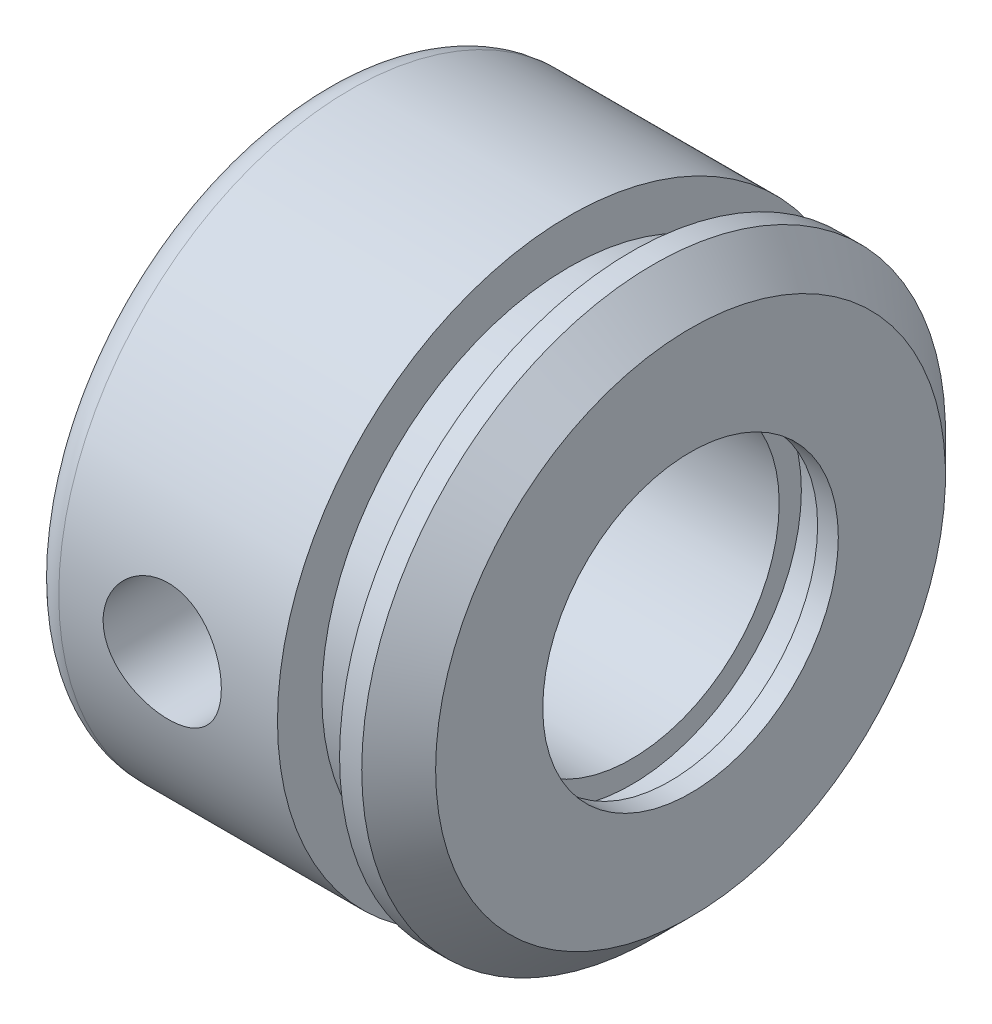
ISO-10303-21;
HEADER;
FILE_DESCRIPTION(('STEP AP214'),'2;1');
FILE_NAME('part.step','',(''),(''),'','','');
FILE_SCHEMA(('AUTOMOTIVE_DESIGN { 1 0 10303 214 1 1 1 1 }'));
ENDSEC;
DATA;
#1=APPLICATION_CONTEXT('core data for automotive mechanical design processes');
#2=APPLICATION_PROTOCOL_DEFINITION('international standard','automotive_design',2000,#1);
#3=PRODUCT_CONTEXT('',#1,'mechanical');
#4=PRODUCT('Part','Part','',(#3));
#5=PRODUCT_RELATED_PRODUCT_CATEGORY('part','',(#4));
#6=PRODUCT_DEFINITION_FORMATION('','',#4);
#7=PRODUCT_DEFINITION_CONTEXT('part definition',#1,'design');
#8=PRODUCT_DEFINITION('design','',#6,#7);
#9=PRODUCT_DEFINITION_SHAPE('','',#8);
#10=(LENGTH_UNIT() NAMED_UNIT(*) SI_UNIT(.MILLI.,.METRE.));
#11=(NAMED_UNIT(*) PLANE_ANGLE_UNIT() SI_UNIT($,.RADIAN.));
#12=(NAMED_UNIT(*) SI_UNIT($,.STERADIAN.) SOLID_ANGLE_UNIT());
#13=UNCERTAINTY_MEASURE_WITH_UNIT(LENGTH_MEASURE(1.E-05),#10,'distance_accuracy_value','');
#14=(GEOMETRIC_REPRESENTATION_CONTEXT(3) GLOBAL_UNCERTAINTY_ASSIGNED_CONTEXT((#13)) GLOBAL_UNIT_ASSIGNED_CONTEXT((#10,
#11,#12)) REPRESENTATION_CONTEXT('',''));
#15=CARTESIAN_POINT('',(0.,0.,0.));
#16=DIRECTION('',(0.,0.,1.));
#17=DIRECTION('',(1.,0.,0.));
#18=AXIS2_PLACEMENT_3D('',#15,#16,#17);
#19=CARTESIAN_POINT('',(-92.,0.,0.));
#20=DIRECTION('',(-1.,0.,0.));
#21=DIRECTION('',(0.,0.,1.));
#22=AXIS2_PLACEMENT_3D('',#19,#20,#21);
#23=CYLINDRICAL_SURFACE('',#22,19.75);
#24=CARTESIAN_POINT('',(-22.,0.,0.));
#25=DIRECTION('',(-1.,0.,0.));
#26=DIRECTION('',(0.,0.,1.));
#27=AXIS2_PLACEMENT_3D('',#24,#25,#26);
#28=CIRCLE('',#27,19.75);
#29=CARTESIAN_POINT('',(-22.,0.,19.75));
#30=VERTEX_POINT('',#29);
#31=EDGE_CURVE('E10',#30,#30,#28,.F.);
#32=ORIENTED_EDGE('',*,*,#31,.T.);
#33=EDGE_LOOP('',(#32));
#34=FACE_BOUND('',#33,.T.);
#35=CARTESIAN_POINT('',(-11.,0.,-19.75));
#36=CARTESIAN_POINT('',(-11.0000081048438,-0.22224806995432,-19.7499958962363));
#37=CARTESIAN_POINT('',(-11.018585405714,-0.444597992091762,-19.7462100877467));
#38=CARTESIAN_POINT('',(-11.092342402588,-0.8830088969307,-19.7314729765692));
#39=CARTESIAN_POINT('',(-11.147550796504,-1.09906481006599,-19.7205160559057));
#40=CARTESIAN_POINT('',(-11.2927912807559,-1.51848598286426,-19.6926597594527));
#41=CARTESIAN_POINT('',(-11.3827896191594,-1.72186332141992,-19.6757661446668));
#42=CARTESIAN_POINT('',(-11.5949540611827,-2.11061840451368,-19.6378712324076));
#43=CARTESIAN_POINT('',(-11.717118391909,-2.29599714031045,-19.6168701613415));
#44=CARTESIAN_POINT('',(-11.9919430317982,-2.6460772527497,-19.5727446180067));
#45=CARTESIAN_POINT('',(-12.1449634523736,-2.81049304028278,-19.5495970012139));
#46=CARTESIAN_POINT('',(-12.476382594132,-3.1115067612523,-19.5039549292504));
#47=CARTESIAN_POINT('',(-12.6547833303368,-3.24810248387175,-19.4814605261113));
#48=CARTESIAN_POINT('',(-13.0339607109168,-3.49082000171905,-19.439445502203));
#49=CARTESIAN_POINT('',(-13.2349309309764,-3.59664499846113,-19.4199546451824));
#50=CARTESIAN_POINT('',(-13.6522600560012,-3.77291537181802,-19.386482707602));
#51=CARTESIAN_POINT('',(-13.8686173971148,-3.84336433798359,-19.3725010680613));
#52=CARTESIAN_POINT('',(-14.3075031395602,-3.94595354018195,-19.3518649919567));
#53=CARTESIAN_POINT('',(-14.5299096749315,-3.97859545063143,-19.3451146929563));
#54=CARTESIAN_POINT('',(-14.9771370229767,-4.00620242058267,-19.3394171376453));
#55=CARTESIAN_POINT('',(-15.2019575798835,-4.00117143297835,-19.3404690626726));
#56=CARTESIAN_POINT('',(-15.6439531457213,-3.95398078024641,-19.3501700409036));
#57=CARTESIAN_POINT('',(-15.8611926363499,-3.91239720638177,-19.3587012111185));
#58=CARTESIAN_POINT('',(-16.2855466486746,-3.79419156186473,-19.3822137192734));
#59=CARTESIAN_POINT('',(-16.4926606751862,-3.71756777946928,-19.3971953723227));
#60=CARTESIAN_POINT('',(-16.8925394641773,-3.53090946742583,-19.4320407440898));
#61=CARTESIAN_POINT('',(-17.085195057076,-3.42064748971734,-19.4519375169913));
#62=CARTESIAN_POINT('',(-17.4494851344402,-3.17000312790072,-19.4943501681082));
#63=CARTESIAN_POINT('',(-17.6211171403312,-3.02961719768965,-19.5168663545304));
#64=CARTESIAN_POINT('',(-17.9418112685913,-2.71963004925279,-19.5624908847158));
#65=CARTESIAN_POINT('',(-18.0903982873366,-2.54953737608477,-19.585602487023));
#66=CARTESIAN_POINT('',(-18.3570075500807,-2.18659585342351,-19.6294334309143));
#67=CARTESIAN_POINT('',(-18.4750293827025,-1.99374669770145,-19.6501527402985));
#68=CARTESIAN_POINT('',(-18.67724976877,-1.59023196380784,-19.6869175229428));
#69=CARTESIAN_POINT('',(-18.7613929787286,-1.37953790851563,-19.7029553369428));
#70=CARTESIAN_POINT('',(-18.8929554895486,-0.946606869842553,-19.7284921446276));
#71=CARTESIAN_POINT('',(-18.9403793545307,-0.72437132470479,-19.7379919509538));
#72=CARTESIAN_POINT('',(-18.9964819581576,-0.278747524608179,-19.7492688738016));
#73=CARTESIAN_POINT('',(-19.005810725046,-0.0554442844005153,-19.7511755402605));
#74=CARTESIAN_POINT('',(-18.9872103970194,0.389530115911798,-19.7474116073557));
#75=CARTESIAN_POINT('',(-18.9592834523788,0.611201369466742,-19.7417414453012));
#76=CARTESIAN_POINT('',(-18.8675043659978,1.04451493822208,-19.7235421195795));
#77=CARTESIAN_POINT('',(-18.8039867217177,1.25623102179643,-19.7110768485899));
#78=CARTESIAN_POINT('',(-18.643195540891,1.66600722123357,-19.6806802036847));
#79=CARTESIAN_POINT('',(-18.5459194277112,1.86406629333409,-19.6627484125468));
#80=CARTESIAN_POINT('',(-18.3189731664371,2.24364076398116,-19.6230855410972));
#81=CARTESIAN_POINT('',(-18.1889128990941,2.42491813774279,-19.6013097275381));
#82=CARTESIAN_POINT('',(-17.9006114834631,2.76330822552575,-19.556477585192));
#83=CARTESIAN_POINT('',(-17.7423672312408,2.92041827441668,-19.5334211155577));
#84=CARTESIAN_POINT('',(-17.3992274444809,3.20853073961514,-19.4881881633942));
#85=CARTESIAN_POINT('',(-17.2139537767602,3.33908638020733,-19.4660310848181));
#86=CARTESIAN_POINT('',(-16.8237248478528,3.56722604575109,-19.4255213233158));
#87=CARTESIAN_POINT('',(-16.6187703847923,3.66481140704029,-19.4071684862093));
#88=CARTESIAN_POINT('',(-16.1960413197888,3.82363546727091,-19.37650286034));
#89=CARTESIAN_POINT('',(-15.9783408476562,3.88506506501422,-19.3641584088752));
#90=CARTESIAN_POINT('',(-15.5354305006131,3.970410497234,-19.3468413674368));
#91=CARTESIAN_POINT('',(-15.3102216373576,3.99433136481509,-19.3418677884083));
#92=CARTESIAN_POINT('',(-14.8631754278964,4.00379034003382,-19.3399115079409));
#93=CARTESIAN_POINT('',(-14.64135336886,3.99003472091527,-19.3427817657639));
#94=CARTESIAN_POINT('',(-14.203255590768,3.92609258628965,-19.3558606985548));
#95=CARTESIAN_POINT('',(-13.9869798246324,3.8759063801309,-19.3660693112094));
#96=CARTESIAN_POINT('',(-13.5665778523039,3.74084622389978,-19.3926081690103));
#97=CARTESIAN_POINT('',(-13.3624220887846,3.65606099786355,-19.4089227475144));
#98=CARTESIAN_POINT('',(-12.9711235641138,3.45429149146972,-19.4458438523061));
#99=CARTESIAN_POINT('',(-12.7839822776071,3.33730442371053,-19.4664507501007));
#100=CARTESIAN_POINT('',(-12.4285126472362,3.07204888065449,-19.5100831370961));
#101=CARTESIAN_POINT('',(-12.2605686016429,2.92327121184783,-19.5331444906023));
#102=CARTESIAN_POINT('',(-11.9517965790597,2.59970653572918,-19.5788321505124));
#103=CARTESIAN_POINT('',(-11.8109748448775,2.4249135567845,-19.6014583556808));
#104=CARTESIAN_POINT('',(-11.5590083718832,2.05201434266876,-19.6440142476618));
#105=CARTESIAN_POINT('',(-11.4481999643862,1.85367707395027,-19.663912231917));
#106=CARTESIAN_POINT('',(-11.2616620974872,1.44084701523437,-19.6984569973284));
#107=CARTESIAN_POINT('',(-11.1859013032398,1.22636885653041,-19.7131084665515));
#108=CARTESIAN_POINT('',(-11.0861307153843,0.842868488706423,-19.7326930123798));
#109=CARTESIAN_POINT('',(-11.0538897988215,0.676016148606986,-19.7391448663407));
#110=CARTESIAN_POINT('',(-11.0108217027504,0.339462283889183,-19.7477998566169));
#111=CARTESIAN_POINT('',(-10.9999938092366,0.169760854462413,-19.7500031345984));
#112=CARTESIAN_POINT('',(-11.,0.,-19.75));
#113=B_SPLINE_CURVE_WITH_KNOTS('',3,(#35,#36,#37,#38,#39,#40,#41,#42,#43,#44,#45,#46,#47,#48,
#49,#50,#51,#52,#53,#54,#55,#56,#57,#58,#59,#60,#61,#62,#63,#64,#65,#66,#67,#68,#69,#70,#71,#72,
#73,#74,#75,#76,#77,#78,#79,#80,#81,#82,#83,#84,#85,#86,#87,#88,#89,#90,#91,#92,#93,#94,#95,#96,
#97,#98,#99,#100,#101,#102,#103,#104,#105,#106,#107,#108,#109,#110,#111,#112),.UNSPECIFIED.,.T.,
.F.,(4,2,2,2,2,2,2,2,2,2,2,2,2,2,2,2,2,2,2,2,2,2,2,2,2,2,2,2,2,2,2,2,2,2,2,2,2,2,4),(0.,
0.666123128202852,1.33276873467623,1.99876920258741,2.66473297022347,3.33897276094297,
4.01326611155423,4.69386258860974,5.37438999263846,6.04577988155233,6.71709932470904,
7.37802433453845,8.0389816345483,8.70451102092719,9.37011879448611,10.0480131409169,
10.7259166106586,11.4049230410955,12.0838450592151,12.7511327510065,13.4183819308623,
14.0794627198652,14.7405939773139,15.4099980521368,16.0794758948312,16.7594248396206,
17.4393462216956,18.1156447130886,18.7918524476783,19.4554713635581,20.1190846444206,
20.7810067757975,21.4429862213909,22.1164917980326,22.790152212289,23.4710756873757,
24.151389190379,24.6602143166334,25.1690224761109),.UNSPECIFIED.);
#114=CARTESIAN_POINT('',(-11.,0.,-19.75));
#115=VERTEX_POINT('',#114);
#116=EDGE_CURVE('E71',#115,#115,#113,.T.);
#117=ORIENTED_EDGE('',*,*,#116,.F.);
#118=EDGE_LOOP('',(#117));
#119=FACE_BOUND('',#118,.T.);
#120=CARTESIAN_POINT('',(-11.,0.,19.75));
#121=CARTESIAN_POINT('',(-11.0000081048438,0.222248069954321,19.7499958962363));
#122=CARTESIAN_POINT('',(-11.018585405714,0.444597992091763,19.7462100877467));
#123=CARTESIAN_POINT('',(-11.092342402588,0.8830088969307,19.7314729765692));
#124=CARTESIAN_POINT('',(-11.147550796504,1.09906481006599,19.7205160559057));
#125=CARTESIAN_POINT('',(-11.2927912807559,1.51848598286426,19.6926597594527));
#126=CARTESIAN_POINT('',(-11.3827896191594,1.72186332141992,19.6757661446668));
#127=CARTESIAN_POINT('',(-11.5949540611827,2.11061840451368,19.6378712324076));
#128=CARTESIAN_POINT('',(-11.717118391909,2.29599714031044,19.6168701613415));
#129=CARTESIAN_POINT('',(-11.9919430317982,2.6460772527497,19.5727446180067));
#130=CARTESIAN_POINT('',(-12.1449634523736,2.81049304028278,19.5495970012139));
#131=CARTESIAN_POINT('',(-12.476382594132,3.1115067612523,19.5039549292504));
#132=CARTESIAN_POINT('',(-12.6547833303368,3.24810248387175,19.4814605261113));
#133=CARTESIAN_POINT('',(-13.0339607109168,3.49082000171905,19.439445502203));
#134=CARTESIAN_POINT('',(-13.2349309309764,3.59664499846114,19.4199546451824));
#135=CARTESIAN_POINT('',(-13.6522600560012,3.77291537181803,19.386482707602));
#136=CARTESIAN_POINT('',(-13.8686173971148,3.84336433798359,19.3725010680613));
#137=CARTESIAN_POINT('',(-14.3075031395602,3.94595354018195,19.3518649919567));
#138=CARTESIAN_POINT('',(-14.5299096749315,3.97859545063143,19.3451146929563));
#139=CARTESIAN_POINT('',(-14.9771370229767,4.00620242058267,19.3394171376453));
#140=CARTESIAN_POINT('',(-15.2019575798835,4.00117143297835,19.3404690626726));
#141=CARTESIAN_POINT('',(-15.6439531457213,3.95398078024641,19.3501700409036));
#142=CARTESIAN_POINT('',(-15.8611926363499,3.91239720638177,19.3587012111185));
#143=CARTESIAN_POINT('',(-16.2855466486746,3.79419156186472,19.3822137192734));
#144=CARTESIAN_POINT('',(-16.4926606751862,3.71756777946928,19.3971953723227));
#145=CARTESIAN_POINT('',(-16.8925394641773,3.53090946742583,19.4320407440898));
#146=CARTESIAN_POINT('',(-17.085195057076,3.42064748971733,19.4519375169913));
#147=CARTESIAN_POINT('',(-17.4494851344402,3.17000312790072,19.4943501681082));
#148=CARTESIAN_POINT('',(-17.6211171403312,3.02961719768965,19.5168663545304));
#149=CARTESIAN_POINT('',(-17.9418112685913,2.71963004925278,19.5624908847158));
#150=CARTESIAN_POINT('',(-18.0903982873366,2.54953737608477,19.585602487023));
#151=CARTESIAN_POINT('',(-18.3570075500807,2.18659585342351,19.6294334309143));
#152=CARTESIAN_POINT('',(-18.4750293827025,1.99374669770145,19.6501527402985));
#153=CARTESIAN_POINT('',(-18.67724976877,1.59023196380784,19.6869175229428));
#154=CARTESIAN_POINT('',(-18.7613929787286,1.37953790851563,19.7029553369428));
#155=CARTESIAN_POINT('',(-18.8929554895486,0.946606869842551,19.7284921446276));
#156=CARTESIAN_POINT('',(-18.9403793545307,0.724371324704788,19.7379919509538));
#157=CARTESIAN_POINT('',(-18.9964819581576,0.278747524608176,19.7492688738016));
#158=CARTESIAN_POINT('',(-19.005810725046,0.0554442844005117,19.7511755402605));
#159=CARTESIAN_POINT('',(-18.9872103970194,-0.389530115911801,19.7474116073557));
#160=CARTESIAN_POINT('',(-18.9592834523788,-0.611201369466745,19.7417414453012));
#161=CARTESIAN_POINT('',(-18.8675043659978,-1.04451493822208,19.7235421195795));
#162=CARTESIAN_POINT('',(-18.8039867217177,-1.25623102179644,19.7110768485899));
#163=CARTESIAN_POINT('',(-18.643195540891,-1.66600722123358,19.6806802036847));
#164=CARTESIAN_POINT('',(-18.5459194277112,-1.8640662933341,19.6627484125468));
#165=CARTESIAN_POINT('',(-18.3189731664371,-2.24364076398116,19.6230855410972));
#166=CARTESIAN_POINT('',(-18.1889128990941,-2.4249181377428,19.6013097275381));
#167=CARTESIAN_POINT('',(-17.9006114834631,-2.76330822552576,19.556477585192));
#168=CARTESIAN_POINT('',(-17.7423672312408,-2.92041827441668,19.5334211155577));
#169=CARTESIAN_POINT('',(-17.3992274444809,-3.20853073961514,19.4881881633942));
#170=CARTESIAN_POINT('',(-17.2139537767602,-3.33908638020733,19.4660310848181));
#171=CARTESIAN_POINT('',(-16.8237248478528,-3.56722604575109,19.4255213233158));
#172=CARTESIAN_POINT('',(-16.6187703847923,-3.66481140704029,19.4071684862093));
#173=CARTESIAN_POINT('',(-16.1960413197888,-3.82363546727091,19.37650286034));
#174=CARTESIAN_POINT('',(-15.9783408476562,-3.88506506501422,19.3641584088752));
#175=CARTESIAN_POINT('',(-15.5354305006131,-3.970410497234,19.3468413674368));
#176=CARTESIAN_POINT('',(-15.3102216373576,-3.99433136481509,19.3418677884083));
#177=CARTESIAN_POINT('',(-14.8631754278964,-4.00379034003382,19.3399115079409));
#178=CARTESIAN_POINT('',(-14.64135336886,-3.99003472091527,19.3427817657639));
#179=CARTESIAN_POINT('',(-14.203255590768,-3.92609258628965,19.3558606985548));
#180=CARTESIAN_POINT('',(-13.9869798246324,-3.8759063801309,19.3660693112094));
#181=CARTESIAN_POINT('',(-13.5665778523039,-3.74084622389978,19.3926081690103));
#182=CARTESIAN_POINT('',(-13.3624220887846,-3.65606099786355,19.4089227475144));
#183=CARTESIAN_POINT('',(-12.9711235641138,-3.45429149146972,19.4458438523061));
#184=CARTESIAN_POINT('',(-12.7839822776071,-3.33730442371053,19.4664507501007));
#185=CARTESIAN_POINT('',(-12.4285126472362,-3.07204888065449,19.5100831370961));
#186=CARTESIAN_POINT('',(-12.2605686016429,-2.92327121184783,19.5331444906023));
#187=CARTESIAN_POINT('',(-11.9517965790597,-2.59970653572918,19.5788321505124));
#188=CARTESIAN_POINT('',(-11.8109748448775,-2.4249135567845,19.6014583556808));
#189=CARTESIAN_POINT('',(-11.5590083718832,-2.05201434266876,19.6440142476618));
#190=CARTESIAN_POINT('',(-11.4481999643862,-1.85367707395027,19.663912231917));
#191=CARTESIAN_POINT('',(-11.2616620974872,-1.44084701523437,19.6984569973284));
#192=CARTESIAN_POINT('',(-11.1859013032398,-1.22636885653041,19.7131084665515));
#193=CARTESIAN_POINT('',(-11.0861307153843,-0.842868488706419,19.7326930123798));
#194=CARTESIAN_POINT('',(-11.0538897988215,-0.676016148606982,19.7391448663407));
#195=CARTESIAN_POINT('',(-11.0108217027504,-0.339462283889181,19.7477998566169));
#196=CARTESIAN_POINT('',(-10.9999938092366,-0.169760854462413,19.7500031345984));
#197=CARTESIAN_POINT('',(-11.,0.,19.75));
#198=B_SPLINE_CURVE_WITH_KNOTS('',3,(#120,#121,#122,#123,#124,#125,#126,#127,#128,#129,#130,
#131,#132,#133,#134,#135,#136,#137,#138,#139,#140,#141,#142,#143,#144,#145,#146,#147,#148,#149,
#150,#151,#152,#153,#154,#155,#156,#157,#158,#159,#160,#161,#162,#163,#164,#165,#166,#167,#168,
#169,#170,#171,#172,#173,#174,#175,#176,#177,#178,#179,#180,#181,#182,#183,#184,#185,#186,#187,
#188,#189,#190,#191,#192,#193,#194,#195,#196,#197),.UNSPECIFIED.,.T.,.F.,(4,2,2,2,2,2,2,2,2,2,2,
2,2,2,2,2,2,2,2,2,2,2,2,2,2,2,2,2,2,2,2,2,2,2,2,2,2,2,4),(0.,0.666123128202852,1.33276873467623,
1.99876920258741,2.66473297022347,3.33897276094297,4.01326611155423,4.69386258860974,
5.37438999263846,6.04577988155233,6.71709932470904,7.37802433453846,8.0389816345483,
8.70451102092719,9.37011879448611,10.0480131409169,10.7259166106586,11.4049230410955,
12.0838450592151,12.7511327510065,13.4183819308623,14.0794627198652,14.7405939773139,
15.4099980521368,16.0794758948312,16.7594248396206,17.4393462216957,18.1156447130887,
18.7918524476783,19.4554713635581,20.1190846444206,20.7810067757975,21.4429862213909,
22.1164917980326,22.790152212289,23.4710756873757,24.151389190379,24.6602143166334,
25.169022476111),.UNSPECIFIED.);
#199=CARTESIAN_POINT('',(-11.,0.,19.75));
#200=VERTEX_POINT('',#199);
#201=EDGE_CURVE('E98',#200,#200,#198,.T.);
#202=ORIENTED_EDGE('',*,*,#201,.F.);
#203=EDGE_LOOP('',(#202));
#204=FACE_BOUND('',#203,.T.);
#205=CARTESIAN_POINT('',(-7.2,0.,0.));
#206=DIRECTION('',(-1.,0.,0.));
#207=DIRECTION('',(0.,0.,1.));
#208=AXIS2_PLACEMENT_3D('',#205,#206,#207);
#209=CIRCLE('',#208,19.75);
#210=CARTESIAN_POINT('',(-7.2,0.,19.75));
#211=VERTEX_POINT('',#210);
#212=EDGE_CURVE('E51',#211,#211,#209,.T.);
#213=ORIENTED_EDGE('',*,*,#212,.T.);
#214=EDGE_LOOP('',(#213));
#215=FACE_BOUND('',#214,.T.);
#216=ADVANCED_FACE('F36',(#34,#119,#204,#215),#23,.T.);
#217=CARTESIAN_POINT('',(-7.2,19.75,0.));
#218=DIRECTION('',(1.,0.,0.));
#219=DIRECTION('',(0.,0.,-1.));
#220=AXIS2_PLACEMENT_3D('',#217,#218,#219);
#221=PLANE('',#220);
#222=CARTESIAN_POINT('',(-7.2,0.,0.));
#223=DIRECTION('',(-1.,0.,0.));
#224=DIRECTION('',(0.,0.,1.));
#225=AXIS2_PLACEMENT_3D('',#222,#223,#224);
#226=CIRCLE('',#225,16.75);
#227=CARTESIAN_POINT('',(-7.2,0.,16.75));
#228=VERTEX_POINT('',#227);
#229=EDGE_CURVE('E59',#228,#228,#226,.T.);
#230=ORIENTED_EDGE('',*,*,#229,.T.);
#231=EDGE_LOOP('',(#230));
#232=FACE_BOUND('',#231,.T.);
#233=ORIENTED_EDGE('',*,*,#212,.F.);
#234=EDGE_LOOP('',(#233));
#235=FACE_BOUND('',#234,.T.);
#236=ADVANCED_FACE('F145',(#232,#235),#221,.T.);
#237=CARTESIAN_POINT('',(-92.,0.,0.));
#238=DIRECTION('',(-1.,0.,0.));
#239=DIRECTION('',(0.,0.,1.));
#240=AXIS2_PLACEMENT_3D('',#237,#238,#239);
#241=CYLINDRICAL_SURFACE('',#240,16.75);
#242=CARTESIAN_POINT('',(-3.,0.,0.));
#243=DIRECTION('',(-1.,0.,0.));
#244=DIRECTION('',(0.,0.,1.));
#245=AXIS2_PLACEMENT_3D('',#242,#243,#244);
#246=CIRCLE('',#245,16.75);
#247=CARTESIAN_POINT('',(-3.,0.,16.75));
#248=VERTEX_POINT('',#247);
#249=EDGE_CURVE('E137',#248,#248,#246,.T.);
#250=ORIENTED_EDGE('',*,*,#249,.T.);
#251=EDGE_LOOP('',(#250));
#252=FACE_BOUND('',#251,.T.);
#253=ORIENTED_EDGE('',*,*,#229,.F.);
#254=EDGE_LOOP('',(#253));
#255=FACE_BOUND('',#254,.T.);
#256=ADVANCED_FACE('F148',(#252,#255),#241,.T.);
#257=CARTESIAN_POINT('',(-3.,16.75,0.));
#258=DIRECTION('',(-1.,0.,0.));
#259=DIRECTION('',(0.,0.,1.));
#260=AXIS2_PLACEMENT_3D('',#257,#258,#259);
#261=PLANE('',#260);
#262=CARTESIAN_POINT('',(-3.,0.,0.));
#263=DIRECTION('',(-1.,0.,0.));
#264=DIRECTION('',(0.,0.,1.));
#265=AXIS2_PLACEMENT_3D('',#262,#263,#264);
#266=CIRCLE('',#265,19.75);
#267=CARTESIAN_POINT('',(-3.,0.,19.75));
#268=VERTEX_POINT('',#267);
#269=EDGE_CURVE('E134',#268,#268,#266,.T.);
#270=ORIENTED_EDGE('',*,*,#269,.T.);
#271=EDGE_LOOP('',(#270));
#272=FACE_BOUND('',#271,.T.);
#273=ORIENTED_EDGE('',*,*,#249,.F.);
#274=EDGE_LOOP('',(#273));
#275=FACE_BOUND('',#274,.T.);
#276=ADVANCED_FACE('F150',(#272,#275),#261,.T.);
#277=CARTESIAN_POINT('',(-92.,0.,0.));
#278=DIRECTION('',(-1.,0.,0.));
#279=DIRECTION('',(0.,0.,1.));
#280=AXIS2_PLACEMENT_3D('',#277,#278,#279);
#281=CYLINDRICAL_SURFACE('',#280,19.75);
#282=CARTESIAN_POINT('',(-1.5,0.,0.));
#283=DIRECTION('',(-1.,0.,0.));
#284=DIRECTION('',(0.,0.,1.));
#285=AXIS2_PLACEMENT_3D('',#282,#283,#284);
#286=CIRCLE('',#285,19.75);
#287=CARTESIAN_POINT('',(-1.5,0.,19.75));
#288=VERTEX_POINT('',#287);
#289=EDGE_CURVE('E130',#288,#288,#286,.T.);
#290=ORIENTED_EDGE('',*,*,#289,.T.);
#291=EDGE_LOOP('',(#290));
#292=FACE_BOUND('',#291,.T.);
#293=ORIENTED_EDGE('',*,*,#269,.F.);
#294=EDGE_LOOP('',(#293));
#295=FACE_BOUND('',#294,.T.);
#296=ADVANCED_FACE('F157',(#292,#295),#281,.T.);
#297=CARTESIAN_POINT('',(-1.5,0.,0.));
#298=DIRECTION('',(-1.,0.,0.));
#299=DIRECTION('',(0.,0.,1.));
#300=AXIS2_PLACEMENT_3D('',#297,#298,#299);
#301=CONICAL_SURFACE('',#300,19.75,0.785398163397442);
#302=CARTESIAN_POINT('',(1.,0.,0.));
#303=DIRECTION('',(-1.,0.,0.));
#304=DIRECTION('',(0.,0.,1.));
#305=AXIS2_PLACEMENT_3D('',#302,#303,#304);
#306=CIRCLE('',#305,17.25);
#307=CARTESIAN_POINT('',(1.,0.,17.25));
#308=VERTEX_POINT('',#307);
#309=EDGE_CURVE('E126',#308,#308,#306,.T.);
#310=ORIENTED_EDGE('',*,*,#309,.T.);
#311=EDGE_LOOP('',(#310));
#312=FACE_BOUND('',#311,.T.);
#313=ORIENTED_EDGE('',*,*,#289,.F.);
#314=EDGE_LOOP('',(#313));
#315=FACE_BOUND('',#314,.T.);
#316=ADVANCED_FACE('F209',(#312,#315),#301,.T.);
#317=CARTESIAN_POINT('',(0.999999999999997,17.25,0.));
#318=DIRECTION('',(1.,0.,0.));
#319=DIRECTION('',(0.,0.,-1.));
#320=AXIS2_PLACEMENT_3D('',#317,#318,#319);
#321=PLANE('',#320);
#322=CARTESIAN_POINT('',(1.,0.,0.));
#323=DIRECTION('',(-1.,0.,0.));
#324=DIRECTION('',(0.,0.,1.));
#325=AXIS2_PLACEMENT_3D('',#322,#323,#324);
#326=CIRCLE('',#325,10.);
#327=CARTESIAN_POINT('',(1.,0.,10.));
#328=VERTEX_POINT('',#327);
#329=EDGE_CURVE('E123',#328,#328,#326,.T.);
#330=ORIENTED_EDGE('',*,*,#329,.T.);
#331=EDGE_LOOP('',(#330));
#332=FACE_BOUND('',#331,.T.);
#333=ORIENTED_EDGE('',*,*,#309,.F.);
#334=EDGE_LOOP('',(#333));
#335=FACE_BOUND('',#334,.T.);
#336=ADVANCED_FACE('F203',(#332,#335),#321,.T.);
#337=CARTESIAN_POINT('',(-92.,0.,0.));
#338=DIRECTION('',(-1.,0.,0.));
#339=DIRECTION('',(0.,0.,1.));
#340=AXIS2_PLACEMENT_3D('',#337,#338,#339);
#341=CYLINDRICAL_SURFACE('',#340,10.);
#342=CARTESIAN_POINT('',(-0.400000000000011,0.,0.));
#343=DIRECTION('',(-1.,0.,0.));
#344=DIRECTION('',(0.,0.,1.));
#345=AXIS2_PLACEMENT_3D('',#342,#343,#344);
#346=CIRCLE('',#345,10.);
#347=CARTESIAN_POINT('',(-0.400000000000011,0.,10.));
#348=VERTEX_POINT('',#347);
#349=EDGE_CURVE('E119',#348,#348,#346,.T.);
#350=ORIENTED_EDGE('',*,*,#349,.T.);
#351=EDGE_LOOP('',(#350));
#352=FACE_BOUND('',#351,.T.);
#353=ORIENTED_EDGE('',*,*,#329,.F.);
#354=EDGE_LOOP('',(#353));
#355=FACE_BOUND('',#354,.T.);
#356=ADVANCED_FACE('F197',(#352,#355),#341,.F.);
#357=CARTESIAN_POINT('',(-0.400000000000005,10.,0.));
#358=DIRECTION('',(-1.,0.,0.));
#359=DIRECTION('',(0.,0.,1.));
#360=AXIS2_PLACEMENT_3D('',#357,#358,#359);
#361=PLANE('',#360);
#362=CARTESIAN_POINT('',(-0.400000000000011,0.,0.));
#363=DIRECTION('',(-1.,0.,0.));
#364=DIRECTION('',(0.,0.,1.));
#365=AXIS2_PLACEMENT_3D('',#362,#363,#364);
#366=CIRCLE('',#365,11.5);
#367=CARTESIAN_POINT('',(-0.400000000000011,0.,11.5));
#368=VERTEX_POINT('',#367);
#369=EDGE_CURVE('E115',#368,#368,#366,.T.);
#370=ORIENTED_EDGE('',*,*,#369,.T.);
#371=EDGE_LOOP('',(#370));
#372=FACE_BOUND('',#371,.T.);
#373=ORIENTED_EDGE('',*,*,#349,.F.);
#374=EDGE_LOOP('',(#373));
#375=FACE_BOUND('',#374,.T.);
#376=ADVANCED_FACE('F191',(#372,#375),#361,.T.);
#377=CARTESIAN_POINT('',(-92.,0.,0.));
#378=DIRECTION('',(-1.,0.,0.));
#379=DIRECTION('',(0.,0.,1.));
#380=AXIS2_PLACEMENT_3D('',#377,#378,#379);
#381=CYLINDRICAL_SURFACE('',#380,11.5);
#382=CARTESIAN_POINT('',(-3.,0.,0.));
#383=DIRECTION('',(-1.,0.,0.));
#384=DIRECTION('',(0.,0.,1.));
#385=AXIS2_PLACEMENT_3D('',#382,#383,#384);
#386=CIRCLE('',#385,11.5);
#387=CARTESIAN_POINT('',(-3.,0.,11.5));
#388=VERTEX_POINT('',#387);
#389=EDGE_CURVE('E112',#388,#388,#386,.T.);
#390=ORIENTED_EDGE('',*,*,#389,.T.);
#391=EDGE_LOOP('',(#390));
#392=FACE_BOUND('',#391,.T.);
#393=ORIENTED_EDGE('',*,*,#369,.F.);
#394=EDGE_LOOP('',(#393));
#395=FACE_BOUND('',#394,.T.);
#396=ADVANCED_FACE('F186',(#392,#395),#381,.F.);
#397=CARTESIAN_POINT('',(-3.,11.5,0.));
#398=DIRECTION('',(1.,0.,0.));
#399=DIRECTION('',(0.,0.,-1.));
#400=AXIS2_PLACEMENT_3D('',#397,#398,#399);
#401=PLANE('',#400);
#402=CARTESIAN_POINT('',(-3.,0.,0.));
#403=DIRECTION('',(-1.,0.,0.));
#404=DIRECTION('',(0.,0.,1.));
#405=AXIS2_PLACEMENT_3D('',#402,#403,#404);
#406=CIRCLE('',#405,10.);
#407=CARTESIAN_POINT('',(-3.,0.,10.));
#408=VERTEX_POINT('',#407);
#409=EDGE_CURVE('E109',#408,#408,#406,.T.);
#410=ORIENTED_EDGE('',*,*,#409,.T.);
#411=EDGE_LOOP('',(#410));
#412=FACE_BOUND('',#411,.T.);
#413=ORIENTED_EDGE('',*,*,#389,.F.);
#414=EDGE_LOOP('',(#413));
#415=FACE_BOUND('',#414,.T.);
#416=ADVANCED_FACE('F176',(#412,#415),#401,.T.);
#417=CARTESIAN_POINT('',(-92.,0.,0.));
#418=DIRECTION('',(-1.,0.,0.));
#419=DIRECTION('',(0.,0.,1.));
#420=AXIS2_PLACEMENT_3D('',#417,#418,#419);
#421=CYLINDRICAL_SURFACE('',#420,10.);
#422=CARTESIAN_POINT('',(-11.,0.,10.));
#423=CARTESIAN_POINT('',(-11.0000015749329,-0.107549581345537,9.99999886871264));
#424=CARTESIAN_POINT('',(-11.0043436710802,-0.215132147940362,9.99825999367799));
#425=CARTESIAN_POINT('',(-11.0216733827839,-0.42953520054955,9.99134740691108));
#426=CARTESIAN_POINT('',(-11.0346664534026,-0.536355162703303,9.98617152790588));
#427=CARTESIAN_POINT('',(-11.0692080345506,-0.748635856497417,9.97250573560117));
#428=CARTESIAN_POINT('',(-11.0907750546198,-0.85409313444087,9.96400865312144));
#429=CARTESIAN_POINT('',(-11.1422417304368,-1.0626676111401,9.94393017211574));
#430=CARTESIAN_POINT('',(-11.1721447662553,-1.16578384227259,9.932347522545));
#431=CARTESIAN_POINT('',(-11.273722808716,-1.46979509681069,9.89349112162205));
#432=CARTESIAN_POINT('',(-11.3574218190064,-1.66629107461992,9.86204458846134));
#433=CARTESIAN_POINT('',(-11.5540462173498,-2.04217417878101,9.79113035538708));
#434=CARTESIAN_POINT('',(-11.6669614601149,-2.22156721456798,9.75166544086262));
#435=CARTESIAN_POINT('',(-11.9244687545217,-2.56699339938209,9.66661825353092));
#436=CARTESIAN_POINT('',(-12.0702127105756,-2.73212223266508,9.62084608086599));
#437=CARTESIAN_POINT('',(-12.386800609152,-3.03635232313263,9.52921139577231));
#438=CARTESIAN_POINT('',(-12.5576567590165,-3.17544084661153,9.48334885017047));
#439=CARTESIAN_POINT('',(-12.9288559685663,-3.42974847409894,9.39445587657958));
#440=CARTESIAN_POINT('',(-13.1301729260637,-3.54362978572887,9.35164233015934));
#441=CARTESIAN_POINT('',(-13.5510728428009,-3.73550961465233,9.2766729328807));
#442=CARTESIAN_POINT('',(-13.7706470677414,-3.81352517485723,9.24451202207146));
#443=CARTESIAN_POINT('',(-14.2114246556858,-3.92779760260541,9.19652715590089));
#444=CARTESIAN_POINT('',(-14.4321024680881,-3.96578791979826,9.18002840771385));
#445=CARTESIAN_POINT('',(-14.8772699996773,-4.00434593508728,9.16328008038143));
#446=CARTESIAN_POINT('',(-15.1017577900111,-4.00493203570086,9.16302251073203));
#447=CARTESIAN_POINT('',(-15.5315133422232,-3.9699787321474,9.17821000534301));
#448=CARTESIAN_POINT('',(-15.7370314287657,-3.93695062778272,9.19256349925666));
#449=CARTESIAN_POINT('',(-16.1393191123503,-3.83989376129508,9.23352375055553));
#450=CARTESIAN_POINT('',(-16.3360871763063,-3.77585958980135,9.26013264599921));
#451=CARTESIAN_POINT('',(-16.7200356722919,-3.6173894649114,9.32318970221162));
#452=CARTESIAN_POINT('',(-16.9069384780825,-3.52235972457939,9.35982758573424));
#453=CARTESIAN_POINT('',(-17.26283163275,-3.30501292151569,9.43876232767927));
#454=CARTESIAN_POINT('',(-17.4318152188131,-3.1826856102159,9.48106130910412));
#455=CARTESIAN_POINT('',(-17.760819457596,-2.90310119889356,9.57053473488081));
#456=CARTESIAN_POINT('',(-17.9191374588899,-2.74387492593717,9.61783329953252));
#457=CARTESIAN_POINT('',(-18.2073689560062,-2.40062885486449,9.70919649915615));
#458=CARTESIAN_POINT('',(-18.3372767948212,-2.21660413066997,9.75326048890393));
#459=CARTESIAN_POINT('',(-18.5672348948311,-1.82415530521055,9.83429362529358));
#460=CARTESIAN_POINT('',(-18.666644562394,-1.61532098269266,9.87110540190899));
#461=CARTESIAN_POINT('',(-18.8283357221563,-1.18204753096606,9.93229656657448));
#462=CARTESIAN_POINT('',(-18.8906360751149,-0.957616393699399,9.95668226924746));
#463=CARTESIAN_POINT('',(-18.9728965908394,-0.513791775215591,9.98912279013839));
#464=CARTESIAN_POINT('',(-18.9951449085071,-0.294886587971141,9.99805891667034));
#465=CARTESIAN_POINT('',(-19.0034262010573,0.143690619615706,10.0013695702126));
#466=CARTESIAN_POINT('',(-18.9894685630952,0.363362426448183,9.99574787164577));
#467=CARTESIAN_POINT('',(-18.9274164948959,0.786865478243655,9.97115134127512));
#468=CARTESIAN_POINT('',(-18.8808840392975,0.990964983549762,9.95278782691064));
#469=CARTESIAN_POINT('',(-18.757128583381,1.38827085612275,9.90518882810983));
#470=CARTESIAN_POINT('',(-18.6799016406648,1.58147582045412,9.87595194712999));
#471=CARTESIAN_POINT('',(-18.4944301206379,1.95815757162884,9.80833189541687));
#472=CARTESIAN_POINT('',(-18.3853090559053,2.14115604549353,9.76969631959847));
#473=CARTESIAN_POINT('',(-18.1401193521971,2.4868871825104,9.68746729490809));
#474=CARTESIAN_POINT('',(-18.0040399141861,2.64961168158684,9.64387186219643));
#475=CARTESIAN_POINT('',(-17.6982599740674,2.96144608598878,9.55290235277181));
#476=CARTESIAN_POINT('',(-17.5269329168592,3.10894786734725,9.50546882853787));
#477=CARTESIAN_POINT('',(-17.1611198341097,3.37350239509234,9.4148334583058));
#478=CARTESIAN_POINT('',(-16.9666299998006,3.4905501236659,9.37163231039242));
#479=CARTESIAN_POINT('',(-16.5570766103267,3.69161500286277,9.2942859982933));
#480=CARTESIAN_POINT('',(-16.3418319997565,3.77530118531766,9.2602326182174));
#481=CARTESIAN_POINT('',(-15.8985326983872,3.90459244315908,9.20647346903737));
#482=CARTESIAN_POINT('',(-15.6704875951582,3.95022562452797,9.18675711197461));
#483=CARTESIAN_POINT('',(-15.225744190156,3.99943122157416,9.16543518780389));
#484=CARTESIAN_POINT('',(-15.009410298105,4.00579411777209,9.16262842667612));
#485=CARTESIAN_POINT('',(-14.5789103072789,3.98360636538274,9.17229671415009));
#486=CARTESIAN_POINT('',(-14.3647439367175,3.9550601501471,9.18476982225497));
#487=CARTESIAN_POINT('',(-13.9533355391097,3.86614256488129,9.2225330048627));
#488=CARTESIAN_POINT('',(-13.7557591537789,3.80707437387706,9.2472967218297));
#489=CARTESIAN_POINT('',(-13.3732430382103,3.66001151041638,9.30647993934966));
#490=CARTESIAN_POINT('',(-13.1883068148887,3.5720088493455,9.34090210615105));
#491=CARTESIAN_POINT('',(-12.8247795892905,3.36374310804133,9.41797252826471));
#492=CARTESIAN_POINT('',(-12.6471581693117,3.24192140926543,9.46097893410836));
#493=CARTESIAN_POINT('',(-12.3140178573752,2.97179350239176,9.54927479921251));
#494=CARTESIAN_POINT('',(-12.15850565271,2.82347931168581,9.59456494363941));
#495=CARTESIAN_POINT('',(-11.8635764074694,2.49297412446699,9.68587647140964));
#496=CARTESIAN_POINT('',(-11.7258566160177,2.30921017071955,9.73175488236393));
#497=CARTESIAN_POINT('',(-11.5439518910625,2.01716584575533,9.7949502762577));
#498=CARTESIAN_POINT('',(-11.487392936147,1.91699501972425,9.81509269692655));
#499=CARTESIAN_POINT('',(-11.3829620045947,1.7118011098248,9.85294835133019));
#500=CARTESIAN_POINT('',(-11.335086050192,1.60678027559742,9.87066269647665));
#501=CARTESIAN_POINT('',(-11.249252015315,1.39454646904328,9.9028559935491));
#502=CARTESIAN_POINT('',(-11.2111298452528,1.28740777135871,9.91738778532477));
#503=CARTESIAN_POINT('',(-11.1440786522788,1.06995577523383,9.94319722915714));
#504=CARTESIAN_POINT('',(-11.1151453426501,0.959643983352613,9.95447639837582));
#505=CARTESIAN_POINT('',(-11.066825163851,0.736945215856832,9.97343330649399));
#506=CARTESIAN_POINT('',(-11.047414088355,0.624564263591278,9.98112017494336));
#507=CARTESIAN_POINT('',(-11.0182614293338,0.398419132407602,9.99270031578293));
#508=CARTESIAN_POINT('',(-11.0085129731657,0.284655994966352,9.99659628445551));
#509=CARTESIAN_POINT('',(-11.0012141044266,0.113830463425492,9.99951445883957));
#510=CARTESIAN_POINT('',(-10.999999166478,0.0569198512645297,10.0000005987258));
#511=CARTESIAN_POINT('',(-11.,0.,10.));
#512=B_SPLINE_CURVE_WITH_KNOTS('',3,(#422,#423,#424,#425,#426,#427,#428,#429,#430,#431,#432,
#433,#434,#435,#436,#437,#438,#439,#440,#441,#442,#443,#444,#445,#446,#447,#448,#449,#450,#451,
#452,#453,#454,#455,#456,#457,#458,#459,#460,#461,#462,#463,#464,#465,#466,#467,#468,#469,#470,
#471,#472,#473,#474,#475,#476,#477,#478,#479,#480,#481,#482,#483,#484,#485,#486,#487,#488,#489,
#490,#491,#492,#493,#494,#495,#496,#497,#498,#499,#500,#501,#502,#503,#504,#505,#506,#507,#508,
#509,#510,#511),.UNSPECIFIED.,.T.,.F.,(4,2,2,2,2,2,2,2,2,2,2,2,2,2,2,2,2,2,2,2,2,2,2,2,2,2,2,2,
2,2,2,2,2,2,2,2,2,2,2,2,2,2,2,2,4),(0.,0.322603993422156,0.645411604786483,0.968919914471236,
1.29255959093094,1.93701523385824,2.58124739027476,3.25313995292302,3.9253602176033,
4.62749749529941,5.32930078128043,5.99927442509164,6.66891844572483,7.29195888698822,
7.9151080641227,8.55097484497806,9.18708075776541,9.87235930273289,10.5577741757964,
11.2567305822579,11.9553314412776,12.6125760095619,13.2696501904034,13.8972014302891,
14.5248332988777,15.171662586967,15.8187515089811,16.50856181149,17.1984856998767,
17.8950932218183,18.5911857719204,19.2371857868567,19.8831037702627,20.5034786899771,
21.124025035105,21.7801016801356,22.4363763459696,23.1352007896785,23.4851924266232,
23.8350233218042,24.1785111324565,24.52183846562,24.8642884495951,25.2064946871486,
25.3772305569976),.UNSPECIFIED.);
#513=CARTESIAN_POINT('',(-11.,0.,10.));
#514=VERTEX_POINT('',#513);
#515=EDGE_CURVE('E62',#514,#514,#512,.T.);
#516=ORIENTED_EDGE('',*,*,#515,.F.);
#517=EDGE_LOOP('',(#516));
#518=FACE_BOUND('',#517,.T.);
#519=CARTESIAN_POINT('',(-11.,0.,-10.));
#520=CARTESIAN_POINT('',(-11.0000015749329,0.107549581345536,-9.99999886871264));
#521=CARTESIAN_POINT('',(-11.0043436710802,0.215132147940361,-9.99825999367799));
#522=CARTESIAN_POINT('',(-11.0216733827839,0.429535200549548,-9.99134740691108));
#523=CARTESIAN_POINT('',(-11.0346664534026,0.5363551627033,-9.98617152790588));
#524=CARTESIAN_POINT('',(-11.0692080345506,0.748635856497416,-9.97250573560117));
#525=CARTESIAN_POINT('',(-11.0907750546198,0.854093134440869,-9.96400865312144));
#526=CARTESIAN_POINT('',(-11.1422417304368,1.0626676111401,-9.94393017211574));
#527=CARTESIAN_POINT('',(-11.1721447662553,1.16578384227259,-9.932347522545));
#528=CARTESIAN_POINT('',(-11.273722808716,1.46979509681069,-9.89349112162205));
#529=CARTESIAN_POINT('',(-11.3574218190064,1.66629107461992,-9.86204458846134));
#530=CARTESIAN_POINT('',(-11.5540462173498,2.04217417878102,-9.79113035538708));
#531=CARTESIAN_POINT('',(-11.6669614601149,2.22156721456798,-9.75166544086262));
#532=CARTESIAN_POINT('',(-11.9244687545217,2.56699339938209,-9.66661825353092));
#533=CARTESIAN_POINT('',(-12.0702127105756,2.73212223266508,-9.62084608086599));
#534=CARTESIAN_POINT('',(-12.386800609152,3.03635232313263,-9.52921139577231));
#535=CARTESIAN_POINT('',(-12.5576567590165,3.17544084661153,-9.48334885017047));
#536=CARTESIAN_POINT('',(-12.9288559685663,3.42974847409894,-9.39445587657958));
#537=CARTESIAN_POINT('',(-13.1301729260637,3.54362978572887,-9.35164233015934));
#538=CARTESIAN_POINT('',(-13.5510728428009,3.73550961465233,-9.2766729328807));
#539=CARTESIAN_POINT('',(-13.7706470677414,3.81352517485723,-9.24451202207146));
#540=CARTESIAN_POINT('',(-14.2114246556858,3.92779760260541,-9.19652715590089));
#541=CARTESIAN_POINT('',(-14.4321024680881,3.96578791979826,-9.18002840771385));
#542=CARTESIAN_POINT('',(-14.8772699996773,4.00434593508728,-9.16328008038142));
#543=CARTESIAN_POINT('',(-15.1017577900111,4.00493203570086,-9.16302251073202));
#544=CARTESIAN_POINT('',(-15.5315133422232,3.9699787321474,-9.17821000534301));
#545=CARTESIAN_POINT('',(-15.7370314287657,3.93695062778272,-9.19256349925666));
#546=CARTESIAN_POINT('',(-16.1393191123503,3.83989376129508,-9.23352375055553));
#547=CARTESIAN_POINT('',(-16.3360871763063,3.77585958980135,-9.26013264599921));
#548=CARTESIAN_POINT('',(-16.7200356722919,3.6173894649114,-9.32318970221162));
#549=CARTESIAN_POINT('',(-16.9069384780825,3.52235972457939,-9.35982758573424));
#550=CARTESIAN_POINT('',(-17.2628316327501,3.30501292151569,-9.43876232767927));
#551=CARTESIAN_POINT('',(-17.4318152188131,3.18268561021589,-9.48106130910411));
#552=CARTESIAN_POINT('',(-17.760819457596,2.90310119889356,-9.57053473488081));
#553=CARTESIAN_POINT('',(-17.9191374588899,2.74387492593716,-9.61783329953252));
#554=CARTESIAN_POINT('',(-18.2073689560062,2.40062885486449,-9.70919649915615));
#555=CARTESIAN_POINT('',(-18.3372767948212,2.21660413066997,-9.75326048890393));
#556=CARTESIAN_POINT('',(-18.5672348948311,1.82415530521055,-9.83429362529358));
#557=CARTESIAN_POINT('',(-18.666644562394,1.61532098269266,-9.87110540190899));
#558=CARTESIAN_POINT('',(-18.8283357221563,1.18204753096606,-9.93229656657448));
#559=CARTESIAN_POINT('',(-18.8906360751149,0.9576163936994,-9.95668226924746));
#560=CARTESIAN_POINT('',(-18.9728965908394,0.513791775215591,-9.98912279013839));
#561=CARTESIAN_POINT('',(-18.9951449085071,0.294886587971142,-9.99805891667034));
#562=CARTESIAN_POINT('',(-19.0034262010573,-0.143690619615705,-10.0013695702126));
#563=CARTESIAN_POINT('',(-18.9894685630952,-0.363362426448182,-9.99574787164577));
#564=CARTESIAN_POINT('',(-18.9274164948959,-0.786865478243654,-9.97115134127512));
#565=CARTESIAN_POINT('',(-18.8808840392975,-0.990964983549761,-9.95278782691064));
#566=CARTESIAN_POINT('',(-18.757128583381,-1.38827085612275,-9.90518882810983));
#567=CARTESIAN_POINT('',(-18.6799016406648,-1.58147582045412,-9.87595194712999));
#568=CARTESIAN_POINT('',(-18.4944301206379,-1.95815757162884,-9.80833189541687));
#569=CARTESIAN_POINT('',(-18.3853090559053,-2.14115604549353,-9.76969631959847));
#570=CARTESIAN_POINT('',(-18.1401193521971,-2.4868871825104,-9.68746729490809));
#571=CARTESIAN_POINT('',(-18.0040399141861,-2.64961168158684,-9.64387186219643));
#572=CARTESIAN_POINT('',(-17.6982599740674,-2.96144608598878,-9.55290235277181));
#573=CARTESIAN_POINT('',(-17.5269329168592,-3.10894786734725,-9.50546882853787));
#574=CARTESIAN_POINT('',(-17.1611198341097,-3.37350239509234,-9.4148334583058));
#575=CARTESIAN_POINT('',(-16.9666299998006,-3.4905501236659,-9.37163231039242));
#576=CARTESIAN_POINT('',(-16.5570766103267,-3.69161500286277,-9.2942859982933));
#577=CARTESIAN_POINT('',(-16.3418319997565,-3.77530118531766,-9.26023261821741));
#578=CARTESIAN_POINT('',(-15.8985326983872,-3.90459244315908,-9.20647346903737));
#579=CARTESIAN_POINT('',(-15.6704875951582,-3.95022562452798,-9.18675711197461));
#580=CARTESIAN_POINT('',(-15.225744190156,-3.99943122157416,-9.16543518780389));
#581=CARTESIAN_POINT('',(-15.009410298105,-4.00579411777209,-9.16262842667612));
#582=CARTESIAN_POINT('',(-14.5789103072789,-3.98360636538274,-9.17229671415009));
#583=CARTESIAN_POINT('',(-14.3647439367175,-3.9550601501471,-9.18476982225497));
#584=CARTESIAN_POINT('',(-13.9533355391097,-3.86614256488129,-9.2225330048627));
#585=CARTESIAN_POINT('',(-13.7557591537789,-3.80707437387706,-9.2472967218297));
#586=CARTESIAN_POINT('',(-13.3732430382103,-3.66001151041638,-9.30647993934966));
#587=CARTESIAN_POINT('',(-13.1883068148887,-3.5720088493455,-9.34090210615105));
#588=CARTESIAN_POINT('',(-12.8247795892905,-3.36374310804133,-9.41797252826471));
#589=CARTESIAN_POINT('',(-12.6471581693117,-3.24192140926543,-9.46097893410836));
#590=CARTESIAN_POINT('',(-12.3140178573752,-2.97179350239176,-9.54927479921251));
#591=CARTESIAN_POINT('',(-12.15850565271,-2.82347931168581,-9.59456494363941));
#592=CARTESIAN_POINT('',(-11.8635764074694,-2.49297412446699,-9.68587647140964));
#593=CARTESIAN_POINT('',(-11.7258566160177,-2.30921017071955,-9.73175488236393));
#594=CARTESIAN_POINT('',(-11.5439518910625,-2.01716584575533,-9.7949502762577));
#595=CARTESIAN_POINT('',(-11.487392936147,-1.91699501972425,-9.81509269692655));
#596=CARTESIAN_POINT('',(-11.3829620045947,-1.7118011098248,-9.85294835133019));
#597=CARTESIAN_POINT('',(-11.335086050192,-1.60678027559742,-9.87066269647665));
#598=CARTESIAN_POINT('',(-11.249252015315,-1.39454646904328,-9.9028559935491));
#599=CARTESIAN_POINT('',(-11.2111298452528,-1.28740777135871,-9.91738778532477));
#600=CARTESIAN_POINT('',(-11.1440786522788,-1.06995577523383,-9.94319722915714));
#601=CARTESIAN_POINT('',(-11.1151453426501,-0.959643983352615,-9.95447639837582));
#602=CARTESIAN_POINT('',(-11.066825163851,-0.736945215856833,-9.97343330649399));
#603=CARTESIAN_POINT('',(-11.047414088355,-0.624564263591278,-9.98112017494336));
#604=CARTESIAN_POINT('',(-11.0182614293338,-0.398419132407601,-9.99270031578293));
#605=CARTESIAN_POINT('',(-11.0085129731657,-0.284655994966352,-9.99659628445551));
#606=CARTESIAN_POINT('',(-11.0012141044266,-0.113830463425492,-9.99951445883957));
#607=CARTESIAN_POINT('',(-10.999999166478,-0.0569198512645297,-10.0000005987258));
#608=CARTESIAN_POINT('',(-11.,0.,-10.));
#609=B_SPLINE_CURVE_WITH_KNOTS('',3,(#519,#520,#521,#522,#523,#524,#525,#526,#527,#528,#529,
#530,#531,#532,#533,#534,#535,#536,#537,#538,#539,#540,#541,#542,#543,#544,#545,#546,#547,#548,
#549,#550,#551,#552,#553,#554,#555,#556,#557,#558,#559,#560,#561,#562,#563,#564,#565,#566,#567,
#568,#569,#570,#571,#572,#573,#574,#575,#576,#577,#578,#579,#580,#581,#582,#583,#584,#585,#586,
#587,#588,#589,#590,#591,#592,#593,#594,#595,#596,#597,#598,#599,#600,#601,#602,#603,#604,#605,
#606,#607,#608),.UNSPECIFIED.,.T.,.F.,(4,2,2,2,2,2,2,2,2,2,2,2,2,2,2,2,2,2,2,2,2,2,2,2,2,2,2,2,
2,2,2,2,2,2,2,2,2,2,2,2,2,2,2,2,4),(0.,0.322603993422155,0.645411604786482,0.968919914471235,
1.29255959093094,1.93701523385824,2.58124739027476,3.25313995292302,3.9253602176033,
4.62749749529941,5.32930078128043,5.99927442509165,6.66891844572483,7.29195888698823,
7.9151080641227,8.55097484497807,9.18708075776541,9.87235930273289,10.5577741757964,
11.2567305822579,11.9553314412776,12.6125760095619,13.2696501904034,13.8972014302891,
14.5248332988777,15.171662586967,15.8187515089811,16.50856181149,17.1984856998767,
17.8950932218183,18.5911857719204,19.2371857868567,19.8831037702627,20.5034786899771,
21.124025035105,21.7801016801356,22.4363763459696,23.1352007896785,23.4851924266232,
23.8350233218042,24.1785111324565,24.52183846562,24.8642884495951,25.2064946871486,
25.3772305569976),.UNSPECIFIED.);
#610=CARTESIAN_POINT('',(-11.,0.,-10.));
#611=VERTEX_POINT('',#610);
#612=EDGE_CURVE('E72',#611,#611,#609,.T.);
#613=ORIENTED_EDGE('',*,*,#612,.F.);
#614=EDGE_LOOP('',(#613));
#615=FACE_BOUND('',#614,.T.);
#616=CARTESIAN_POINT('',(-24.,0.,0.));
#617=DIRECTION('',(-1.,0.,0.));
#618=DIRECTION('',(0.,0.,1.));
#619=AXIS2_PLACEMENT_3D('',#616,#617,#618);
#620=CIRCLE('',#619,10.);
#621=CARTESIAN_POINT('',(-24.,0.,10.));
#622=VERTEX_POINT('',#621);
#623=EDGE_CURVE('E105',#622,#622,#620,.T.);
#624=ORIENTED_EDGE('',*,*,#623,.T.);
#625=EDGE_LOOP('',(#624));
#626=FACE_BOUND('',#625,.T.);
#627=ORIENTED_EDGE('',*,*,#409,.F.);
#628=EDGE_LOOP('',(#627));
#629=FACE_BOUND('',#628,.T.);
#630=ADVANCED_FACE('F76',(#518,#615,#626,#629),#421,.F.);
#631=CARTESIAN_POINT('',(-24.,10.,0.));
#632=DIRECTION('',(-1.,0.,0.));
#633=DIRECTION('',(0.,0.,1.));
#634=AXIS2_PLACEMENT_3D('',#631,#632,#633);
#635=PLANE('',#634);
#636=CARTESIAN_POINT('',(-24.,0.,0.));
#637=DIRECTION('',(-1.,0.,0.));
#638=DIRECTION('',(0.,0.,1.));
#639=AXIS2_PLACEMENT_3D('',#636,#637,#638);
#640=CIRCLE('',#639,17.75);
#641=CARTESIAN_POINT('',(-24.,0.,17.75));
#642=VERTEX_POINT('',#641);
#643=EDGE_CURVE('E44',#642,#642,#640,.T.);
#644=ORIENTED_EDGE('',*,*,#643,.T.);
#645=EDGE_LOOP('',(#644));
#646=FACE_BOUND('',#645,.T.);
#647=ORIENTED_EDGE('',*,*,#623,.F.);
#648=EDGE_LOOP('',(#647));
#649=FACE_BOUND('',#648,.T.);
#650=ADVANCED_FACE('F85',(#646,#649),#635,.T.);
#651=CARTESIAN_POINT('',(-15.,0.,-19.75));
#652=DIRECTION('',(0.,0.,1.));
#653=DIRECTION('',(1.,0.,0.));
#654=AXIS2_PLACEMENT_3D('',#651,#652,#653);
#655=CYLINDRICAL_SURFACE('',#654,4.);
#656=ORIENTED_EDGE('',*,*,#116,.T.);
#657=EDGE_LOOP('',(#656));
#658=FACE_BOUND('',#657,.T.);
#659=ORIENTED_EDGE('',*,*,#612,.T.);
#660=EDGE_LOOP('',(#659));
#661=FACE_BOUND('',#660,.T.);
#662=ADVANCED_FACE('F80',(#658,#661),#655,.F.);
#663=ORIENTED_EDGE('',*,*,#201,.T.);
#664=EDGE_LOOP('',(#663));
#665=FACE_BOUND('',#664,.T.);
#666=ORIENTED_EDGE('',*,*,#515,.T.);
#667=EDGE_LOOP('',(#666));
#668=FACE_BOUND('',#667,.T.);
#669=ADVANCED_FACE('F84',(#665,#668),#655,.F.);
#670=CARTESIAN_POINT('',(-22.,0.,0.));
#671=DIRECTION('',(-1.,0.,0.));
#672=DIRECTION('',(0.,0.,1.));
#673=AXIS2_PLACEMENT_3D('',#670,#671,#672);
#674=TOROIDAL_SURFACE('',#673,17.75,2.);
#675=ORIENTED_EDGE('',*,*,#31,.F.);
#676=EDGE_LOOP('',(#675));
#677=FACE_BOUND('',#676,.T.);
#678=ORIENTED_EDGE('',*,*,#643,.F.);
#679=EDGE_LOOP('',(#678));
#680=FACE_BOUND('',#679,.T.);
#681=ADVANCED_FACE('F87',(#677,#680),#674,.T.);
#682=CLOSED_SHELL('',(#216,#236,#256,#276,#296,#316,#336,#356,#376,#396,#416,#630,#650,#662,
#669,#681));
#683=MANIFOLD_SOLID_BREP('B2',#682);
#684=ADVANCED_BREP_SHAPE_REPRESENTATION('',(#18,#683),#14);
#685=SHAPE_DEFINITION_REPRESENTATION(#9,#684);
ENDSEC;
END-ISO-10303-21;
